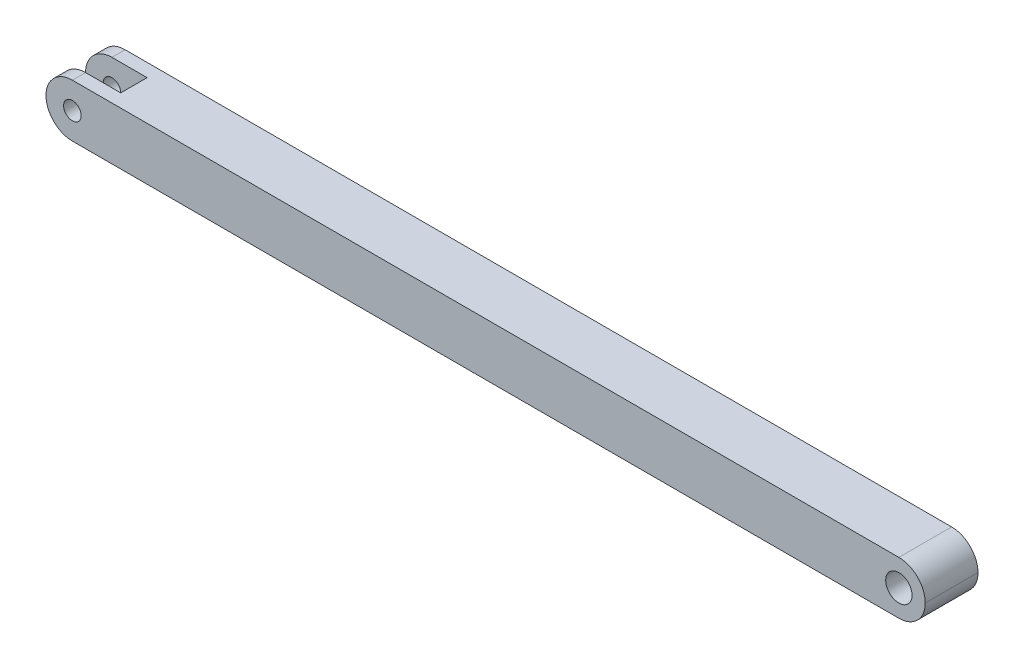
ISO-10303-21;
HEADER;
FILE_DESCRIPTION(('STEP AP214'),'2;1');
FILE_NAME('part.step','',(''),(''),'','','');
FILE_SCHEMA(('AUTOMOTIVE_DESIGN { 1 0 10303 214 1 1 1 1 }'));
ENDSEC;
DATA;
#1=APPLICATION_CONTEXT('core data for automotive mechanical design processes');
#2=APPLICATION_PROTOCOL_DEFINITION('international standard','automotive_design',2000,#1);
#3=PRODUCT_CONTEXT('',#1,'mechanical');
#4=PRODUCT('Part','Part','',(#3));
#5=PRODUCT_RELATED_PRODUCT_CATEGORY('part','',(#4));
#6=PRODUCT_DEFINITION_FORMATION('','',#4);
#7=PRODUCT_DEFINITION_CONTEXT('part definition',#1,'design');
#8=PRODUCT_DEFINITION('design','',#6,#7);
#9=PRODUCT_DEFINITION_SHAPE('','',#8);
#10=(LENGTH_UNIT() NAMED_UNIT(*) SI_UNIT(.MILLI.,.METRE.));
#11=(NAMED_UNIT(*) PLANE_ANGLE_UNIT() SI_UNIT($,.RADIAN.));
#12=(NAMED_UNIT(*) SI_UNIT($,.STERADIAN.) SOLID_ANGLE_UNIT());
#13=UNCERTAINTY_MEASURE_WITH_UNIT(LENGTH_MEASURE(1.E-05),#10,'distance_accuracy_value','');
#14=(GEOMETRIC_REPRESENTATION_CONTEXT(3) GLOBAL_UNCERTAINTY_ASSIGNED_CONTEXT((#13)) GLOBAL_UNIT_ASSIGNED_CONTEXT((#10,
#11,#12)) REPRESENTATION_CONTEXT('',''));
#15=CARTESIAN_POINT('',(0.,0.,0.));
#16=DIRECTION('',(0.,0.,1.));
#17=DIRECTION('',(1.,0.,0.));
#18=AXIS2_PLACEMENT_3D('',#15,#16,#17);
#19=CARTESIAN_POINT('',(500.,0.,15.));
#20=DIRECTION('',(0.,1.,0.));
#21=DIRECTION('',(-1.,0.,0.));
#22=AXIS2_PLACEMENT_3D('',#19,#20,#21);
#23=PLANE('',#22);
#24=DIRECTION('',(1.,0.,0.));
#25=VECTOR('',#24,1.);
#26=CARTESIAN_POINT('',(500.,0.,15.));
#27=LINE('',#26,#25);
#28=CARTESIAN_POINT('',(15.,0.,15.));
#29=VERTEX_POINT('',#28);
#30=CARTESIAN_POINT('',(485.,0.,15.));
#31=VERTEX_POINT('',#30);
#32=EDGE_CURVE('E147',#29,#31,#27,.T.);
#33=ORIENTED_EDGE('',*,*,#32,.F.);
#34=DIRECTION('',(0.,0.,-1.));
#35=VECTOR('',#34,1.);
#36=CARTESIAN_POINT('',(15.,0.,15.));
#37=LINE('',#36,#35);
#38=CARTESIAN_POINT('',(15.,0.,7.49999999999999));
#39=VERTEX_POINT('',#38);
#40=EDGE_CURVE('E168',#29,#39,#37,.T.);
#41=ORIENTED_EDGE('',*,*,#40,.T.);
#42=DIRECTION('',(-1.,0.,0.));
#43=VECTOR('',#42,1.);
#44=CARTESIAN_POINT('',(35.,0.,7.49999999999999));
#45=LINE('',#44,#43);
#46=CARTESIAN_POINT('',(35.,0.,7.49999999999999));
#47=VERTEX_POINT('',#46);
#48=EDGE_CURVE('E227',#47,#39,#45,.T.);
#49=ORIENTED_EDGE('',*,*,#48,.F.);
#50=DIRECTION('',(0.,0.,1.));
#51=VECTOR('',#50,1.);
#52=CARTESIAN_POINT('',(35.,0.,-7.5));
#53=LINE('',#52,#51);
#54=CARTESIAN_POINT('',(35.,0.,-7.5));
#55=VERTEX_POINT('',#54);
#56=EDGE_CURVE('E137',#55,#47,#53,.T.);
#57=ORIENTED_EDGE('',*,*,#56,.F.);
#58=DIRECTION('',(1.,0.,0.));
#59=VECTOR('',#58,1.);
#60=CARTESIAN_POINT('',(0.,0.,-7.5));
#61=LINE('',#60,#59);
#62=CARTESIAN_POINT('',(15.,0.,-7.5));
#63=VERTEX_POINT('',#62);
#64=EDGE_CURVE('E230',#63,#55,#61,.T.);
#65=ORIENTED_EDGE('',*,*,#64,.F.);
#66=DIRECTION('',(0.,0.,-1.));
#67=VECTOR('',#66,1.);
#68=CARTESIAN_POINT('',(15.,0.,15.));
#69=LINE('',#68,#67);
#70=CARTESIAN_POINT('',(15.,0.,-15.));
#71=VERTEX_POINT('',#70);
#72=EDGE_CURVE('E165',#63,#71,#69,.T.);
#73=ORIENTED_EDGE('',*,*,#72,.T.);
#74=DIRECTION('',(1.,0.,0.));
#75=VECTOR('',#74,1.);
#76=CARTESIAN_POINT('',(500.,0.,-15.));
#77=LINE('',#76,#75);
#78=CARTESIAN_POINT('',(485.,0.,-15.));
#79=VERTEX_POINT('',#78);
#80=EDGE_CURVE('E145',#71,#79,#77,.T.);
#81=ORIENTED_EDGE('',*,*,#80,.T.);
#82=DIRECTION('',(0.,0.,-1.));
#83=VECTOR('',#82,1.);
#84=CARTESIAN_POINT('',(485.,0.,15.));
#85=LINE('',#84,#83);
#86=EDGE_CURVE('E154',#79,#31,#85,.F.);
#87=ORIENTED_EDGE('',*,*,#86,.T.);
#88=EDGE_LOOP('',(#33,#41,#49,#57,#65,#73,#81,#87));
#89=FACE_BOUND('',#88,.T.);
#90=ADVANCED_FACE('F35',(#89),#23,.F.);
#91=CARTESIAN_POINT('',(0.,30.,15.));
#92=DIRECTION('',(0.,-1.,0.));
#93=DIRECTION('',(0.,0.,-1.));
#94=AXIS2_PLACEMENT_3D('',#91,#92,#93);
#95=PLANE('',#94);
#96=DIRECTION('',(-1.,0.,0.));
#97=VECTOR('',#96,1.);
#98=CARTESIAN_POINT('',(0.,30.,-15.));
#99=LINE('',#98,#97);
#100=CARTESIAN_POINT('',(485.,30.,-15.));
#101=VERTEX_POINT('',#100);
#102=CARTESIAN_POINT('',(15.,30.,-15.));
#103=VERTEX_POINT('',#102);
#104=EDGE_CURVE('E151',#101,#103,#99,.T.);
#105=ORIENTED_EDGE('',*,*,#104,.T.);
#106=DIRECTION('',(0.,0.,-1.));
#107=VECTOR('',#106,1.);
#108=CARTESIAN_POINT('',(15.,30.,15.));
#109=LINE('',#108,#107);
#110=CARTESIAN_POINT('',(15.,30.,-7.5));
#111=VERTEX_POINT('',#110);
#112=EDGE_CURVE('E11',#103,#111,#109,.F.);
#113=ORIENTED_EDGE('',*,*,#112,.T.);
#114=DIRECTION('',(-1.,0.,0.));
#115=VECTOR('',#114,1.);
#116=CARTESIAN_POINT('',(0.,30.,-7.5));
#117=LINE('',#116,#115);
#118=CARTESIAN_POINT('',(35.,30.,-7.5));
#119=VERTEX_POINT('',#118);
#120=EDGE_CURVE('E130',#119,#111,#117,.T.);
#121=ORIENTED_EDGE('',*,*,#120,.F.);
#122=DIRECTION('',(0.,0.,-1.));
#123=VECTOR('',#122,1.);
#124=CARTESIAN_POINT('',(35.,30.,-7.5));
#125=LINE('',#124,#123);
#126=CARTESIAN_POINT('',(35.,30.,7.49999999999999));
#127=VERTEX_POINT('',#126);
#128=EDGE_CURVE('E129',#127,#119,#125,.T.);
#129=ORIENTED_EDGE('',*,*,#128,.F.);
#130=DIRECTION('',(1.,0.,0.));
#131=VECTOR('',#130,1.);
#132=CARTESIAN_POINT('',(35.,30.,7.49999999999999));
#133=LINE('',#132,#131);
#134=CARTESIAN_POINT('',(15.,30.,7.49999999999999));
#135=VERTEX_POINT('',#134);
#136=EDGE_CURVE('E119',#135,#127,#133,.T.);
#137=ORIENTED_EDGE('',*,*,#136,.F.);
#138=DIRECTION('',(0.,0.,-1.));
#139=VECTOR('',#138,1.);
#140=CARTESIAN_POINT('',(15.,30.,15.));
#141=LINE('',#140,#139);
#142=CARTESIAN_POINT('',(15.,30.,15.));
#143=VERTEX_POINT('',#142);
#144=EDGE_CURVE('E44',#135,#143,#141,.F.);
#145=ORIENTED_EDGE('',*,*,#144,.T.);
#146=DIRECTION('',(-1.,0.,0.));
#147=VECTOR('',#146,1.);
#148=CARTESIAN_POINT('',(0.,30.,15.));
#149=LINE('',#148,#147);
#150=CARTESIAN_POINT('',(485.,30.,15.));
#151=VERTEX_POINT('',#150);
#152=EDGE_CURVE('E150',#151,#143,#149,.T.);
#153=ORIENTED_EDGE('',*,*,#152,.F.);
#154=DIRECTION('',(0.,0.,-1.));
#155=VECTOR('',#154,1.);
#156=CARTESIAN_POINT('',(485.,30.,15.));
#157=LINE('',#156,#155);
#158=EDGE_CURVE('E193',#151,#101,#157,.T.);
#159=ORIENTED_EDGE('',*,*,#158,.T.);
#160=EDGE_LOOP('',(#105,#113,#121,#129,#137,#145,#153,#159));
#161=FACE_BOUND('',#160,.T.);
#162=ADVANCED_FACE('F141',(#161),#95,.F.);
#163=CARTESIAN_POINT('',(0.,0.,15.));
#164=DIRECTION('',(0.,0.,-1.));
#165=DIRECTION('',(-1.,0.,0.));
#166=AXIS2_PLACEMENT_3D('',#163,#164,#165);
#167=PLANE('',#166);
#168=CARTESIAN_POINT('',(15.,15.,15.));
#169=DIRECTION('',(0.,0.,-1.));
#170=DIRECTION('',(-1.,0.,0.));
#171=AXIS2_PLACEMENT_3D('',#168,#169,#170);
#172=CIRCLE('',#171,5.);
#173=CARTESIAN_POINT('',(10.,15.,15.));
#174=VERTEX_POINT('',#173);
#175=EDGE_CURVE('E233',#174,#174,#172,.T.);
#176=ORIENTED_EDGE('',*,*,#175,.T.);
#177=EDGE_LOOP('',(#176));
#178=FACE_BOUND('',#177,.T.);
#179=CARTESIAN_POINT('',(485.,15.,15.));
#180=DIRECTION('',(0.,0.,-1.));
#181=DIRECTION('',(-1.,0.,0.));
#182=AXIS2_PLACEMENT_3D('',#179,#180,#181);
#183=CIRCLE('',#182,7.50000000000001);
#184=CARTESIAN_POINT('',(477.5,15.,15.));
#185=VERTEX_POINT('',#184);
#186=EDGE_CURVE('E228',#185,#185,#183,.T.);
#187=ORIENTED_EDGE('',*,*,#186,.T.);
#188=EDGE_LOOP('',(#187));
#189=FACE_BOUND('',#188,.T.);
#190=CARTESIAN_POINT('',(15.,15.,15.));
#191=DIRECTION('',(0.,0.,-1.));
#192=DIRECTION('',(-1.,0.,0.));
#193=AXIS2_PLACEMENT_3D('',#190,#191,#192);
#194=CIRCLE('',#193,15.);
#195=CARTESIAN_POINT('',(0.,15.,15.));
#196=VERTEX_POINT('',#195);
#197=EDGE_CURVE('E178',#143,#196,#194,.F.);
#198=ORIENTED_EDGE('',*,*,#197,.T.);
#199=CARTESIAN_POINT('',(15.,15.,15.));
#200=DIRECTION('',(0.,0.,-1.));
#201=DIRECTION('',(-1.,0.,0.));
#202=AXIS2_PLACEMENT_3D('',#199,#200,#201);
#203=CIRCLE('',#202,15.);
#204=EDGE_CURVE('E180',#196,#29,#203,.F.);
#205=ORIENTED_EDGE('',*,*,#204,.T.);
#206=ORIENTED_EDGE('',*,*,#32,.T.);
#207=CARTESIAN_POINT('',(485.,15.,15.));
#208=DIRECTION('',(0.,0.,-1.));
#209=DIRECTION('',(-1.,0.,0.));
#210=AXIS2_PLACEMENT_3D('',#207,#208,#209);
#211=CIRCLE('',#210,15.);
#212=CARTESIAN_POINT('',(500.,15.,15.));
#213=VERTEX_POINT('',#212);
#214=EDGE_CURVE('E176',#31,#213,#211,.F.);
#215=ORIENTED_EDGE('',*,*,#214,.T.);
#216=CARTESIAN_POINT('',(485.,15.,15.));
#217=DIRECTION('',(0.,0.,-1.));
#218=DIRECTION('',(-1.,0.,0.));
#219=AXIS2_PLACEMENT_3D('',#216,#217,#218);
#220=CIRCLE('',#219,15.);
#221=EDGE_CURVE('E174',#213,#151,#220,.F.);
#222=ORIENTED_EDGE('',*,*,#221,.T.);
#223=ORIENTED_EDGE('',*,*,#152,.T.);
#224=EDGE_LOOP('',(#198,#205,#206,#215,#222,#223));
#225=FACE_BOUND('',#224,.T.);
#226=ADVANCED_FACE('F215',(#178,#189,#225),#167,.F.);
#227=CARTESIAN_POINT('',(0.,0.,-15.));
#228=DIRECTION('',(0.,0.,-1.));
#229=DIRECTION('',(-1.,0.,0.));
#230=AXIS2_PLACEMENT_3D('',#227,#228,#229);
#231=PLANE('',#230);
#232=CARTESIAN_POINT('',(15.,15.,-15.));
#233=DIRECTION('',(0.,0.,1.));
#234=DIRECTION('',(1.,0.,0.));
#235=AXIS2_PLACEMENT_3D('',#232,#233,#234);
#236=CIRCLE('',#235,5.);
#237=CARTESIAN_POINT('',(20.,15.,-15.));
#238=VERTEX_POINT('',#237);
#239=EDGE_CURVE('E162',#238,#238,#236,.T.);
#240=ORIENTED_EDGE('',*,*,#239,.T.);
#241=EDGE_LOOP('',(#240));
#242=FACE_BOUND('',#241,.T.);
#243=CARTESIAN_POINT('',(485.,15.,-15.));
#244=DIRECTION('',(0.,0.,1.));
#245=DIRECTION('',(1.,0.,0.));
#246=AXIS2_PLACEMENT_3D('',#243,#244,#245);
#247=CIRCLE('',#246,7.50000000000001);
#248=CARTESIAN_POINT('',(492.5,15.,-15.));
#249=VERTEX_POINT('',#248);
#250=EDGE_CURVE('E198',#249,#249,#247,.T.);
#251=ORIENTED_EDGE('',*,*,#250,.T.);
#252=EDGE_LOOP('',(#251));
#253=FACE_BOUND('',#252,.T.);
#254=ORIENTED_EDGE('',*,*,#80,.F.);
#255=CARTESIAN_POINT('',(15.,15.,-15.));
#256=DIRECTION('',(0.,0.,-1.));
#257=DIRECTION('',(-1.,0.,0.));
#258=AXIS2_PLACEMENT_3D('',#255,#256,#257);
#259=CIRCLE('',#258,15.);
#260=CARTESIAN_POINT('',(0.,15.,-15.));
#261=VERTEX_POINT('',#260);
#262=EDGE_CURVE('E188',#71,#261,#259,.T.);
#263=ORIENTED_EDGE('',*,*,#262,.T.);
#264=CARTESIAN_POINT('',(15.,15.,-15.));
#265=DIRECTION('',(0.,0.,-1.));
#266=DIRECTION('',(-1.,0.,0.));
#267=AXIS2_PLACEMENT_3D('',#264,#265,#266);
#268=CIRCLE('',#267,15.);
#269=EDGE_CURVE('E186',#261,#103,#268,.T.);
#270=ORIENTED_EDGE('',*,*,#269,.T.);
#271=ORIENTED_EDGE('',*,*,#104,.F.);
#272=CARTESIAN_POINT('',(485.,15.,-15.));
#273=DIRECTION('',(0.,0.,-1.));
#274=DIRECTION('',(-1.,0.,0.));
#275=AXIS2_PLACEMENT_3D('',#272,#273,#274);
#276=CIRCLE('',#275,15.);
#277=CARTESIAN_POINT('',(500.,15.,-15.));
#278=VERTEX_POINT('',#277);
#279=EDGE_CURVE('E182',#101,#278,#276,.T.);
#280=ORIENTED_EDGE('',*,*,#279,.T.);
#281=CARTESIAN_POINT('',(485.,15.,-15.));
#282=DIRECTION('',(0.,0.,-1.));
#283=DIRECTION('',(-1.,0.,0.));
#284=AXIS2_PLACEMENT_3D('',#281,#282,#283);
#285=CIRCLE('',#284,15.);
#286=EDGE_CURVE('E184',#278,#79,#285,.T.);
#287=ORIENTED_EDGE('',*,*,#286,.T.);
#288=EDGE_LOOP('',(#254,#263,#270,#271,#280,#287));
#289=FACE_BOUND('',#288,.T.);
#290=ADVANCED_FACE('F246',(#242,#253,#289),#231,.T.);
#291=CARTESIAN_POINT('',(0.,-0.001000000000001,-7.5));
#292=DIRECTION('',(0.,0.,-1.));
#293=DIRECTION('',(-1.,0.,0.));
#294=AXIS2_PLACEMENT_3D('',#291,#292,#293);
#295=PLANE('',#294);
#296=CARTESIAN_POINT('',(15.,15.,-7.5));
#297=DIRECTION('',(0.,0.,-1.));
#298=DIRECTION('',(-1.,0.,0.));
#299=AXIS2_PLACEMENT_3D('',#296,#297,#298);
#300=CIRCLE('',#299,5.);
#301=CARTESIAN_POINT('',(10.,15.,-7.5));
#302=VERTEX_POINT('',#301);
#303=EDGE_CURVE('E161',#302,#302,#300,.T.);
#304=ORIENTED_EDGE('',*,*,#303,.T.);
#305=EDGE_LOOP('',(#304));
#306=FACE_BOUND('',#305,.T.);
#307=CARTESIAN_POINT('',(15.,15.,-7.5));
#308=DIRECTION('',(0.,0.,-1.));
#309=DIRECTION('',(-1.,0.,0.));
#310=AXIS2_PLACEMENT_3D('',#307,#308,#309);
#311=CIRCLE('',#310,15.);
#312=CARTESIAN_POINT('',(0.,15.,-7.5));
#313=VERTEX_POINT('',#312);
#314=EDGE_CURVE('E52',#111,#313,#311,.F.);
#315=ORIENTED_EDGE('',*,*,#314,.T.);
#316=CARTESIAN_POINT('',(15.,15.,-7.5));
#317=DIRECTION('',(0.,0.,-1.));
#318=DIRECTION('',(-1.,0.,0.));
#319=AXIS2_PLACEMENT_3D('',#316,#317,#318);
#320=CIRCLE('',#319,15.);
#321=EDGE_CURVE('E191',#313,#63,#320,.F.);
#322=ORIENTED_EDGE('',*,*,#321,.T.);
#323=ORIENTED_EDGE('',*,*,#64,.T.);
#324=DIRECTION('',(0.,1.,0.));
#325=VECTOR('',#324,1.);
#326=CARTESIAN_POINT('',(35.,-0.001000000000001,-7.5));
#327=LINE('',#326,#325);
#328=EDGE_CURVE('E139',#55,#119,#327,.T.);
#329=ORIENTED_EDGE('',*,*,#328,.T.);
#330=ORIENTED_EDGE('',*,*,#120,.T.);
#331=EDGE_LOOP('',(#315,#322,#323,#329,#330));
#332=FACE_BOUND('',#331,.T.);
#333=ADVANCED_FACE('F237',(#306,#332),#295,.F.);
#334=CARTESIAN_POINT('',(35.,-0.001000000000001,-7.5));
#335=DIRECTION('',(1.,0.,0.));
#336=DIRECTION('',(0.,0.,-1.));
#337=AXIS2_PLACEMENT_3D('',#334,#335,#336);
#338=PLANE('',#337);
#339=ORIENTED_EDGE('',*,*,#56,.T.);
#340=DIRECTION('',(0.,1.,0.));
#341=VECTOR('',#340,1.);
#342=CARTESIAN_POINT('',(35.,-0.001000000000001,7.49999999999999));
#343=LINE('',#342,#341);
#344=EDGE_CURVE('E123',#47,#127,#343,.T.);
#345=ORIENTED_EDGE('',*,*,#344,.T.);
#346=ORIENTED_EDGE('',*,*,#128,.T.);
#347=ORIENTED_EDGE('',*,*,#328,.F.);
#348=EDGE_LOOP('',(#339,#345,#346,#347));
#349=FACE_BOUND('',#348,.T.);
#350=ADVANCED_FACE('F134',(#349),#338,.F.);
#351=CARTESIAN_POINT('',(35.,-0.001000000000001,7.49999999999999));
#352=DIRECTION('',(0.,0.,1.));
#353=DIRECTION('',(1.,0.,0.));
#354=AXIS2_PLACEMENT_3D('',#351,#352,#353);
#355=PLANE('',#354);
#356=CARTESIAN_POINT('',(15.,15.,7.49999999999999));
#357=DIRECTION('',(0.,0.,1.));
#358=DIRECTION('',(1.,0.,0.));
#359=AXIS2_PLACEMENT_3D('',#356,#357,#358);
#360=CIRCLE('',#359,5.);
#361=CARTESIAN_POINT('',(20.,15.,7.49999999999999));
#362=VERTEX_POINT('',#361);
#363=EDGE_CURVE('E158',#362,#362,#360,.T.);
#364=ORIENTED_EDGE('',*,*,#363,.T.);
#365=EDGE_LOOP('',(#364));
#366=FACE_BOUND('',#365,.T.);
#367=ORIENTED_EDGE('',*,*,#48,.T.);
#368=CARTESIAN_POINT('',(15.,15.,7.49999999999999));
#369=DIRECTION('',(0.,0.,1.));
#370=DIRECTION('',(1.,0.,0.));
#371=AXIS2_PLACEMENT_3D('',#368,#369,#370);
#372=CIRCLE('',#371,15.);
#373=CARTESIAN_POINT('',(0.,15.,7.5));
#374=VERTEX_POINT('',#373);
#375=EDGE_CURVE('E172',#39,#374,#372,.F.);
#376=ORIENTED_EDGE('',*,*,#375,.T.);
#377=CARTESIAN_POINT('',(15.,15.,7.49999999999999));
#378=DIRECTION('',(0.,0.,1.));
#379=DIRECTION('',(1.,0.,0.));
#380=AXIS2_PLACEMENT_3D('',#377,#378,#379);
#381=CIRCLE('',#380,15.);
#382=EDGE_CURVE('E126',#374,#135,#381,.F.);
#383=ORIENTED_EDGE('',*,*,#382,.T.);
#384=ORIENTED_EDGE('',*,*,#136,.T.);
#385=ORIENTED_EDGE('',*,*,#344,.F.);
#386=EDGE_LOOP('',(#367,#376,#383,#384,#385));
#387=FACE_BOUND('',#386,.T.);
#388=ADVANCED_FACE('F122',(#366,#387),#355,.F.);
#389=CARTESIAN_POINT('',(15.,15.,-15.));
#390=DIRECTION('',(0.,0.,1.));
#391=DIRECTION('',(1.,0.,0.));
#392=AXIS2_PLACEMENT_3D('',#389,#390,#391);
#393=CYLINDRICAL_SURFACE('',#392,5.);
#394=ORIENTED_EDGE('',*,*,#363,.F.);
#395=EDGE_LOOP('',(#394));
#396=FACE_BOUND('',#395,.T.);
#397=ORIENTED_EDGE('',*,*,#175,.F.);
#398=EDGE_LOOP('',(#397));
#399=FACE_BOUND('',#398,.T.);
#400=ADVANCED_FACE('F312',(#396,#399),#393,.F.);
#401=ORIENTED_EDGE('',*,*,#239,.F.);
#402=EDGE_LOOP('',(#401));
#403=FACE_BOUND('',#402,.T.);
#404=ORIENTED_EDGE('',*,*,#303,.F.);
#405=EDGE_LOOP('',(#404));
#406=FACE_BOUND('',#405,.T.);
#407=ADVANCED_FACE('F304',(#403,#406),#393,.F.);
#408=CARTESIAN_POINT('',(485.,15.,-15.));
#409=DIRECTION('',(0.,0.,1.));
#410=DIRECTION('',(1.,0.,0.));
#411=AXIS2_PLACEMENT_3D('',#408,#409,#410);
#412=CYLINDRICAL_SURFACE('',#411,7.50000000000001);
#413=ORIENTED_EDGE('',*,*,#250,.F.);
#414=EDGE_LOOP('',(#413));
#415=FACE_BOUND('',#414,.T.);
#416=ORIENTED_EDGE('',*,*,#186,.F.);
#417=EDGE_LOOP('',(#416));
#418=FACE_BOUND('',#417,.T.);
#419=ADVANCED_FACE('F271',(#415,#418),#412,.F.);
#420=CARTESIAN_POINT('',(15.,15.,15.));
#421=DIRECTION('',(0.,0.,-1.));
#422=DIRECTION('',(-1.,0.,0.));
#423=AXIS2_PLACEMENT_3D('',#420,#421,#422);
#424=CYLINDRICAL_SURFACE('',#423,15.);
#425=DIRECTION('',(0.,0.,-1.));
#426=VECTOR('',#425,1.);
#427=CARTESIAN_POINT('',(0.,15.,15.));
#428=LINE('',#427,#426);
#429=EDGE_CURVE('E196',#196,#374,#428,.T.);
#430=ORIENTED_EDGE('',*,*,#429,.F.);
#431=ORIENTED_EDGE('',*,*,#197,.F.);
#432=ORIENTED_EDGE('',*,*,#144,.F.);
#433=ORIENTED_EDGE('',*,*,#382,.F.);
#434=EDGE_LOOP('',(#430,#431,#432,#433));
#435=FACE_BOUND('',#434,.T.);
#436=ADVANCED_FACE('F220',(#435),#424,.T.);
#437=CARTESIAN_POINT('',(15.,15.,15.));
#438=DIRECTION('',(0.,0.,-1.));
#439=DIRECTION('',(-1.,0.,0.));
#440=AXIS2_PLACEMENT_3D('',#437,#438,#439);
#441=CYLINDRICAL_SURFACE('',#440,15.);
#442=ORIENTED_EDGE('',*,*,#204,.F.);
#443=ORIENTED_EDGE('',*,*,#429,.T.);
#444=ORIENTED_EDGE('',*,*,#375,.F.);
#445=ORIENTED_EDGE('',*,*,#40,.F.);
#446=EDGE_LOOP('',(#442,#443,#444,#445));
#447=FACE_BOUND('',#446,.T.);
#448=ADVANCED_FACE('F226',(#447),#441,.T.);
#449=CARTESIAN_POINT('',(15.,15.,15.));
#450=DIRECTION('',(0.,0.,-1.));
#451=DIRECTION('',(-1.,0.,0.));
#452=AXIS2_PLACEMENT_3D('',#449,#450,#451);
#453=CYLINDRICAL_SURFACE('',#452,15.);
#454=DIRECTION('',(0.,0.,-1.));
#455=VECTOR('',#454,1.);
#456=CARTESIAN_POINT('',(0.,15.,15.));
#457=LINE('',#456,#455);
#458=EDGE_CURVE('E199',#313,#261,#457,.T.);
#459=ORIENTED_EDGE('',*,*,#458,.F.);
#460=ORIENTED_EDGE('',*,*,#314,.F.);
#461=ORIENTED_EDGE('',*,*,#112,.F.);
#462=ORIENTED_EDGE('',*,*,#269,.F.);
#463=EDGE_LOOP('',(#459,#460,#461,#462));
#464=FACE_BOUND('',#463,.T.);
#465=ADVANCED_FACE('F239',(#464),#453,.T.);
#466=CARTESIAN_POINT('',(15.,15.,15.));
#467=DIRECTION('',(0.,0.,-1.));
#468=DIRECTION('',(-1.,0.,0.));
#469=AXIS2_PLACEMENT_3D('',#466,#467,#468);
#470=CYLINDRICAL_SURFACE('',#469,15.);
#471=ORIENTED_EDGE('',*,*,#321,.F.);
#472=ORIENTED_EDGE('',*,*,#458,.T.);
#473=ORIENTED_EDGE('',*,*,#262,.F.);
#474=ORIENTED_EDGE('',*,*,#72,.F.);
#475=EDGE_LOOP('',(#471,#472,#473,#474));
#476=FACE_BOUND('',#475,.T.);
#477=ADVANCED_FACE('F242',(#476),#470,.T.);
#478=CARTESIAN_POINT('',(485.,15.,15.));
#479=DIRECTION('',(0.,0.,-1.));
#480=DIRECTION('',(-1.,0.,0.));
#481=AXIS2_PLACEMENT_3D('',#478,#479,#480);
#482=CYLINDRICAL_SURFACE('',#481,15.);
#483=ORIENTED_EDGE('',*,*,#158,.F.);
#484=ORIENTED_EDGE('',*,*,#221,.F.);
#485=DIRECTION('',(0.,0.,-1.));
#486=VECTOR('',#485,1.);
#487=CARTESIAN_POINT('',(500.,15.,15.));
#488=LINE('',#487,#486);
#489=EDGE_CURVE('E39',#278,#213,#488,.F.);
#490=ORIENTED_EDGE('',*,*,#489,.F.);
#491=ORIENTED_EDGE('',*,*,#279,.F.);
#492=EDGE_LOOP('',(#483,#484,#490,#491));
#493=FACE_BOUND('',#492,.T.);
#494=ADVANCED_FACE('F37',(#493),#482,.T.);
#495=CARTESIAN_POINT('',(485.,15.,15.));
#496=DIRECTION('',(0.,0.,-1.));
#497=DIRECTION('',(-1.,0.,0.));
#498=AXIS2_PLACEMENT_3D('',#495,#496,#497);
#499=CYLINDRICAL_SURFACE('',#498,15.);
#500=ORIENTED_EDGE('',*,*,#214,.F.);
#501=ORIENTED_EDGE('',*,*,#86,.F.);
#502=ORIENTED_EDGE('',*,*,#286,.F.);
#503=ORIENTED_EDGE('',*,*,#489,.T.);
#504=EDGE_LOOP('',(#500,#501,#502,#503));
#505=FACE_BOUND('',#504,.T.);
#506=ADVANCED_FACE('F207',(#505),#499,.T.);
#507=CLOSED_SHELL('',(#90,#162,#226,#290,#333,#350,#388,#400,#407,#419,#436,#448,#465,#477,#494,#506));
#508=MANIFOLD_SOLID_BREP('B2',#507);
#509=ADVANCED_BREP_SHAPE_REPRESENTATION('',(#18,#508),#14);
#510=SHAPE_DEFINITION_REPRESENTATION(#9,#509);
ENDSEC;
END-ISO-10303-21;
